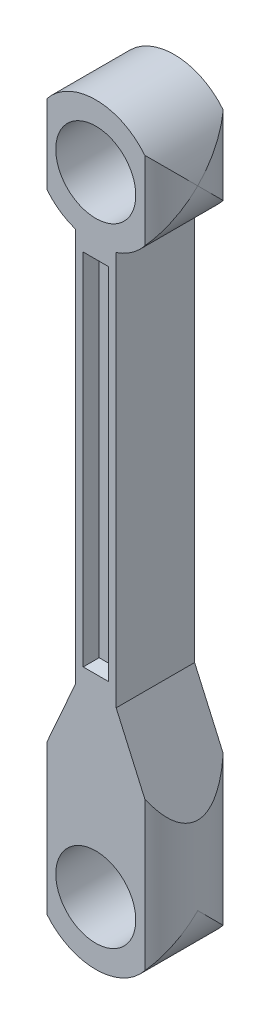
ISO-10303-21;
HEADER;
FILE_DESCRIPTION(('STEP AP214'),'2;1');
FILE_NAME('part.step','',(''),(''),'','','');
FILE_SCHEMA(('AUTOMOTIVE_DESIGN { 1 0 10303 214 1 1 1 1 }'));
ENDSEC;
DATA;
#1=APPLICATION_CONTEXT('core data for automotive mechanical design processes');
#2=APPLICATION_PROTOCOL_DEFINITION('international standard','automotive_design',2000,#1);
#3=PRODUCT_CONTEXT('',#1,'mechanical');
#4=PRODUCT('Part','Part','',(#3));
#5=PRODUCT_RELATED_PRODUCT_CATEGORY('part','',(#4));
#6=PRODUCT_DEFINITION_FORMATION('','',#4);
#7=PRODUCT_DEFINITION_CONTEXT('part definition',#1,'design');
#8=PRODUCT_DEFINITION('design','',#6,#7);
#9=PRODUCT_DEFINITION_SHAPE('','',#8);
#10=(LENGTH_UNIT() NAMED_UNIT(*) SI_UNIT(.MILLI.,.METRE.));
#11=(NAMED_UNIT(*) PLANE_ANGLE_UNIT() SI_UNIT($,.RADIAN.));
#12=(NAMED_UNIT(*) SI_UNIT($,.STERADIAN.) SOLID_ANGLE_UNIT());
#13=UNCERTAINTY_MEASURE_WITH_UNIT(LENGTH_MEASURE(1.E-05),#10,'distance_accuracy_value','');
#14=(GEOMETRIC_REPRESENTATION_CONTEXT(3) GLOBAL_UNCERTAINTY_ASSIGNED_CONTEXT((#13)) GLOBAL_UNIT_ASSIGNED_CONTEXT((#10,
#11,#12)) REPRESENTATION_CONTEXT('',''));
#15=CARTESIAN_POINT('',(0.,0.,0.));
#16=DIRECTION('',(0.,0.,1.));
#17=DIRECTION('',(1.,0.,0.));
#18=AXIS2_PLACEMENT_3D('',#15,#16,#17);
#19=CARTESIAN_POINT('',(10.16,12.7,12.7));
#20=DIRECTION('',(-0.914253955234263,-0.405141586779863,0.));
#21=DIRECTION('',(0.405141586779863,-0.914253955234264,0.));
#22=AXIS2_PLACEMENT_3D('',#19,#20,#21);
#23=PLANE('',#22);
#24=DIRECTION('',(-0.405141586779863,0.914253955234263,0.));
#25=VECTOR('',#24,1.);
#26=CARTESIAN_POINT('',(10.16,12.7,12.7));
#27=LINE('',#26,#25);
#28=CARTESIAN_POINT('',(7.93114745796596,17.7296916403593,12.7));
#29=VERTEX_POINT('',#28);
#30=CARTESIAN_POINT('',(3.302,28.1759566274874,12.7));
#31=VERTEX_POINT('',#30);
#32=EDGE_CURVE('E333',#29,#31,#27,.T.);
#33=ORIENTED_EDGE('',*,*,#32,.F.);
#34=CARTESIAN_POINT('',(0.,35.6273431518332,6.35));
#35=DIRECTION('',(-0.914253955234263,-0.405141586779863,0.));
#36=DIRECTION('',(0.405141586779863,-0.914253955234263,0.));
#37=AXIS2_PLACEMENT_3D('',#34,#35,#36);
#38=ELLIPSE('',#37,25.0776526812601,10.16);
#39=CARTESIAN_POINT('',(7.93114745796596,17.7296916403593,0.));
#40=VERTEX_POINT('',#39);
#41=EDGE_CURVE('E248',#29,#40,#38,.F.);
#42=ORIENTED_EDGE('',*,*,#41,.T.);
#43=DIRECTION('',(-0.405141586779863,0.914253955234263,0.));
#44=VECTOR('',#43,1.);
#45=CARTESIAN_POINT('',(10.16,12.7,0.));
#46=LINE('',#45,#44);
#47=CARTESIAN_POINT('',(3.302,28.1759566274874,0.));
#48=VERTEX_POINT('',#47);
#49=EDGE_CURVE('E350',#40,#48,#46,.T.);
#50=ORIENTED_EDGE('',*,*,#49,.T.);
#51=DIRECTION('',(0.,0.,-1.));
#52=VECTOR('',#51,1.);
#53=CARTESIAN_POINT('',(3.302,28.1759566274874,12.7));
#54=LINE('',#53,#52);
#55=EDGE_CURVE('E12',#31,#48,#54,.T.);
#56=ORIENTED_EDGE('',*,*,#55,.F.);
#57=EDGE_LOOP('',(#33,#42,#50,#56));
#58=FACE_BOUND('',#57,.T.);
#59=ADVANCED_FACE('F38',(#58),#23,.F.);
#60=CARTESIAN_POINT('',(0.,101.6,12.7));
#61=DIRECTION('',(0.,0.,-1.));
#62=DIRECTION('',(-1.,0.,0.));
#63=AXIS2_PLACEMENT_3D('',#60,#61,#62);
#64=CYLINDRICAL_SURFACE('',#63,10.16);
#65=CARTESIAN_POINT('',(0.,101.6,12.7));
#66=DIRECTION('',(0.,0.,1.));
#67=DIRECTION('',(1.,0.,0.));
#68=AXIS2_PLACEMENT_3D('',#65,#66,#67);
#69=CIRCLE('',#68,10.16);
#70=CARTESIAN_POINT('',(-7.93114745796596,95.25,12.7));
#71=VERTEX_POINT('',#70);
#72=CARTESIAN_POINT('',(-3.302,91.9915455977561,12.7));
#73=VERTEX_POINT('',#72);
#74=EDGE_CURVE('E338',#71,#73,#69,.T.);
#75=ORIENTED_EDGE('',*,*,#74,.F.);
#76=CARTESIAN_POINT('',(0.,101.6,6.35));
#77=DIRECTION('',(0.,-0.707106781186548,-0.707106781186547));
#78=DIRECTION('',(0.,0.707106781186548,-0.707106781186547));
#79=AXIS2_PLACEMENT_3D('',#76,#77,#78);
#80=ELLIPSE('',#79,14.3684097937106,10.16);
#81=CARTESIAN_POINT('',(-10.16,101.6,6.35));
#82=VERTEX_POINT('',#81);
#83=EDGE_CURVE('E232',#71,#82,#80,.T.);
#84=ORIENTED_EDGE('',*,*,#83,.T.);
#85=CARTESIAN_POINT('',(0.,101.6,6.35));
#86=DIRECTION('',(0.,0.707106781186548,-0.707106781186547));
#87=DIRECTION('',(0.,-0.707106781186548,-0.707106781186547));
#88=AXIS2_PLACEMENT_3D('',#85,#86,#87);
#89=ELLIPSE('',#88,14.3684097937106,10.16);
#90=CARTESIAN_POINT('',(-7.93114745796597,95.25,0.));
#91=VERTEX_POINT('',#90);
#92=EDGE_CURVE('E210',#82,#91,#89,.F.);
#93=ORIENTED_EDGE('',*,*,#92,.T.);
#94=CARTESIAN_POINT('',(0.,101.6,0.));
#95=DIRECTION('',(0.,0.,1.));
#96=DIRECTION('',(1.,0.,0.));
#97=AXIS2_PLACEMENT_3D('',#94,#95,#96);
#98=CIRCLE('',#97,10.16);
#99=CARTESIAN_POINT('',(-3.302,91.9915455977561,0.));
#100=VERTEX_POINT('',#99);
#101=EDGE_CURVE('E354',#91,#100,#98,.T.);
#102=ORIENTED_EDGE('',*,*,#101,.T.);
#103=DIRECTION('',(0.,0.,-1.));
#104=VECTOR('',#103,1.);
#105=CARTESIAN_POINT('',(-3.302,91.9915455977561,12.7));
#106=LINE('',#105,#104);
#107=EDGE_CURVE('E363',#73,#100,#106,.T.);
#108=ORIENTED_EDGE('',*,*,#107,.F.);
#109=EDGE_LOOP('',(#75,#84,#93,#102,#108));
#110=FACE_BOUND('',#109,.T.);
#111=ADVANCED_FACE('F398',(#110),#64,.T.);
#112=CARTESIAN_POINT('',(7.93114745796597,95.25,0.));
#113=VERTEX_POINT('',#112);
#114=CARTESIAN_POINT('',(10.16,101.6,6.35));
#115=VERTEX_POINT('',#114);
#116=EDGE_CURVE('E203',#113,#115,#89,.F.);
#117=ORIENTED_EDGE('',*,*,#116,.T.);
#118=CARTESIAN_POINT('',(7.93114745796596,95.25,12.7));
#119=VERTEX_POINT('',#118);
#120=EDGE_CURVE('E53',#115,#119,#80,.T.);
#121=ORIENTED_EDGE('',*,*,#120,.T.);
#122=CARTESIAN_POINT('',(3.30199999999999,91.9915455977561,12.7));
#123=VERTEX_POINT('',#122);
#124=EDGE_CURVE('E339',#123,#119,#69,.T.);
#125=ORIENTED_EDGE('',*,*,#124,.F.);
#126=DIRECTION('',(0.,0.,-1.));
#127=VECTOR('',#126,1.);
#128=CARTESIAN_POINT('',(3.30199999999999,91.9915455977561,12.7));
#129=LINE('',#128,#127);
#130=CARTESIAN_POINT('',(3.30199999999999,91.9915455977561,0.));
#131=VERTEX_POINT('',#130);
#132=EDGE_CURVE('E46',#123,#131,#129,.T.);
#133=ORIENTED_EDGE('',*,*,#132,.T.);
#134=EDGE_CURVE('E355',#131,#113,#98,.T.);
#135=ORIENTED_EDGE('',*,*,#134,.T.);
#136=EDGE_LOOP('',(#117,#121,#125,#133,#135));
#137=FACE_BOUND('',#136,.T.);
#138=ADVANCED_FACE('F369',(#137),#64,.T.);
#139=CARTESIAN_POINT('',(-10.16,12.7,12.7));
#140=DIRECTION('',(0.914253955234263,-0.405141586779863,0.));
#141=DIRECTION('',(0.405141586779863,0.914253955234264,0.));
#142=AXIS2_PLACEMENT_3D('',#139,#140,#141);
#143=PLANE('',#142);
#144=DIRECTION('',(-0.405141586779863,-0.914253955234263,0.));
#145=VECTOR('',#144,1.);
#146=CARTESIAN_POINT('',(-10.16,12.7,0.));
#147=LINE('',#146,#145);
#148=CARTESIAN_POINT('',(-3.302,28.1759566274874,0.));
#149=VERTEX_POINT('',#148);
#150=CARTESIAN_POINT('',(-7.93114745796596,17.7296916403593,0.));
#151=VERTEX_POINT('',#150);
#152=EDGE_CURVE('E334',#149,#151,#147,.T.);
#153=ORIENTED_EDGE('',*,*,#152,.T.);
#154=CARTESIAN_POINT('',(0.,35.6273431518332,6.35));
#155=DIRECTION('',(0.914253955234263,-0.405141586779863,0.));
#156=DIRECTION('',(-0.405141586779863,-0.914253955234263,0.));
#157=AXIS2_PLACEMENT_3D('',#154,#155,#156);
#158=ELLIPSE('',#157,25.0776526812601,10.16);
#159=CARTESIAN_POINT('',(-7.93114745796596,17.7296916403593,12.7));
#160=VERTEX_POINT('',#159);
#161=EDGE_CURVE('E211',#151,#160,#158,.F.);
#162=ORIENTED_EDGE('',*,*,#161,.T.);
#163=DIRECTION('',(-0.405141586779863,-0.914253955234263,0.));
#164=VECTOR('',#163,1.);
#165=CARTESIAN_POINT('',(-10.16,12.7,12.7));
#166=LINE('',#165,#164);
#167=CARTESIAN_POINT('',(-3.302,28.1759566274874,12.7));
#168=VERTEX_POINT('',#167);
#169=EDGE_CURVE('E345',#168,#160,#166,.T.);
#170=ORIENTED_EDGE('',*,*,#169,.F.);
#171=DIRECTION('',(0.,0.,-1.));
#172=VECTOR('',#171,1.);
#173=CARTESIAN_POINT('',(-3.302,28.1759566274874,12.7));
#174=LINE('',#173,#172);
#175=EDGE_CURVE('E348',#168,#149,#174,.T.);
#176=ORIENTED_EDGE('',*,*,#175,.T.);
#177=EDGE_LOOP('',(#153,#162,#170,#176));
#178=FACE_BOUND('',#177,.T.);
#179=ADVANCED_FACE('F414',(#178),#143,.F.);
#180=CARTESIAN_POINT('',(0.,0.,12.7));
#181=DIRECTION('',(0.,0.,1.));
#182=DIRECTION('',(1.,0.,0.));
#183=AXIS2_PLACEMENT_3D('',#180,#181,#182);
#184=PLANE('',#183);
#185=DIRECTION('',(0.,-1.,0.));
#186=VECTOR('',#185,1.);
#187=CARTESIAN_POINT('',(-7.93114745796596,111.76,12.7));
#188=LINE('',#187,#186);
#189=CARTESIAN_POINT('',(-7.93114745796596,-6.35,12.7));
#190=VERTEX_POINT('',#189);
#191=EDGE_CURVE('E204',#190,#160,#188,.F.);
#192=ORIENTED_EDGE('',*,*,#191,.F.);
#193=CARTESIAN_POINT('',(0.,0.,12.7));
#194=DIRECTION('',(0.,0.,1.));
#195=DIRECTION('',(1.,0.,0.));
#196=AXIS2_PLACEMENT_3D('',#193,#194,#195);
#197=CIRCLE('',#196,10.16);
#198=CARTESIAN_POINT('',(7.93114745796596,-6.35,12.7));
#199=VERTEX_POINT('',#198);
#200=EDGE_CURVE('E202',#190,#199,#197,.T.);
#201=ORIENTED_EDGE('',*,*,#200,.T.);
#202=DIRECTION('',(0.,-1.,0.));
#203=VECTOR('',#202,1.);
#204=CARTESIAN_POINT('',(7.93114745796596,111.76,12.7));
#205=LINE('',#204,#203);
#206=EDGE_CURVE('E218',#29,#199,#205,.T.);
#207=ORIENTED_EDGE('',*,*,#206,.F.);
#208=ORIENTED_EDGE('',*,*,#32,.T.);
#209=DIRECTION('',(0.,1.,0.));
#210=VECTOR('',#209,1.);
#211=CARTESIAN_POINT('',(3.302,91.9915455977561,12.7));
#212=LINE('',#211,#210);
#213=EDGE_CURVE('E336',#31,#123,#212,.T.);
#214=ORIENTED_EDGE('',*,*,#213,.T.);
#215=ORIENTED_EDGE('',*,*,#124,.T.);
#216=CARTESIAN_POINT('',(7.93114745796597,107.95,12.7));
#217=VERTEX_POINT('',#216);
#218=EDGE_CURVE('E221',#217,#119,#205,.T.);
#219=ORIENTED_EDGE('',*,*,#218,.F.);
#220=CARTESIAN_POINT('',(-7.93114745796597,107.95,12.7));
#221=VERTEX_POINT('',#220);
#222=EDGE_CURVE('E343',#217,#221,#69,.T.);
#223=ORIENTED_EDGE('',*,*,#222,.T.);
#224=EDGE_CURVE('E213',#71,#221,#188,.F.);
#225=ORIENTED_EDGE('',*,*,#224,.F.);
#226=ORIENTED_EDGE('',*,*,#74,.T.);
#227=DIRECTION('',(0.,-1.,0.));
#228=VECTOR('',#227,1.);
#229=CARTESIAN_POINT('',(-3.302,91.9915455977561,12.7));
#230=LINE('',#229,#228);
#231=EDGE_CURVE('E342',#73,#168,#230,.T.);
#232=ORIENTED_EDGE('',*,*,#231,.T.);
#233=ORIENTED_EDGE('',*,*,#169,.T.);
#234=EDGE_LOOP('',(#192,#201,#207,#208,#214,#215,#219,#223,#225,#226,#232,#233));
#235=FACE_BOUND('',#234,.T.);
#236=DIRECTION('',(0.,-1.,0.));
#237=VECTOR('',#236,1.);
#238=CARTESIAN_POINT('',(-2.032,89.408,12.7));
#239=LINE('',#238,#237);
#240=CARTESIAN_POINT('',(-2.032,89.408,12.7));
#241=VERTEX_POINT('',#240);
#242=CARTESIAN_POINT('',(-2.03199999999999,31.242,12.7));
#243=VERTEX_POINT('',#242);
#244=EDGE_CURVE('E269',#241,#243,#239,.T.);
#245=ORIENTED_EDGE('',*,*,#244,.F.);
#246=DIRECTION('',(-1.,0.,0.));
#247=VECTOR('',#246,1.);
#248=CARTESIAN_POINT('',(-2.032,89.408,12.7));
#249=LINE('',#248,#247);
#250=CARTESIAN_POINT('',(2.032,89.408,12.7));
#251=VERTEX_POINT('',#250);
#252=EDGE_CURVE('E295',#251,#241,#249,.T.);
#253=ORIENTED_EDGE('',*,*,#252,.F.);
#254=DIRECTION('',(0.,1.,0.));
#255=VECTOR('',#254,1.);
#256=CARTESIAN_POINT('',(2.032,89.408,12.7));
#257=LINE('',#256,#255);
#258=CARTESIAN_POINT('',(2.03200000000001,31.242,12.7));
#259=VERTEX_POINT('',#258);
#260=EDGE_CURVE('E292',#259,#251,#257,.T.);
#261=ORIENTED_EDGE('',*,*,#260,.F.);
#262=DIRECTION('',(1.,0.,0.));
#263=VECTOR('',#262,1.);
#264=CARTESIAN_POINT('',(-2.03199999999999,31.242,12.7));
#265=LINE('',#264,#263);
#266=EDGE_CURVE('E289',#243,#259,#265,.T.);
#267=ORIENTED_EDGE('',*,*,#266,.F.);
#268=EDGE_LOOP('',(#245,#253,#261,#267));
#269=FACE_BOUND('',#268,.T.);
#270=CARTESIAN_POINT('',(0.,0.,12.7));
#271=DIRECTION('',(0.,0.,1.));
#272=DIRECTION('',(1.,0.,0.));
#273=AXIS2_PLACEMENT_3D('',#270,#271,#272);
#274=CIRCLE('',#273,6.477);
#275=CARTESIAN_POINT('',(-6.477,0.,12.7));
#276=VERTEX_POINT('',#275);
#277=EDGE_CURVE('E326',#276,#276,#274,.T.);
#278=ORIENTED_EDGE('',*,*,#277,.F.);
#279=EDGE_LOOP('',(#278));
#280=FACE_BOUND('',#279,.T.);
#281=CARTESIAN_POINT('',(0.,101.6,12.7));
#282=DIRECTION('',(0.,0.,1.));
#283=DIRECTION('',(1.,0.,0.));
#284=AXIS2_PLACEMENT_3D('',#281,#282,#283);
#285=CIRCLE('',#284,6.477);
#286=CARTESIAN_POINT('',(-6.477,101.6,12.7));
#287=VERTEX_POINT('',#286);
#288=EDGE_CURVE('E320',#287,#287,#285,.T.);
#289=ORIENTED_EDGE('',*,*,#288,.F.);
#290=EDGE_LOOP('',(#289));
#291=FACE_BOUND('',#290,.T.);
#292=ADVANCED_FACE('F379',(#235,#269,#280,#291),#184,.T.);
#293=CARTESIAN_POINT('',(0.,0.,0.));
#294=DIRECTION('',(0.,0.,1.));
#295=DIRECTION('',(1.,0.,0.));
#296=AXIS2_PLACEMENT_3D('',#293,#294,#295);
#297=PLANE('',#296);
#298=DIRECTION('',(-1.,0.,0.));
#299=VECTOR('',#298,1.);
#300=CARTESIAN_POINT('',(2.03199999999999,31.242,0.));
#301=LINE('',#300,#299);
#302=CARTESIAN_POINT('',(2.03199999999999,31.242,0.));
#303=VERTEX_POINT('',#302);
#304=CARTESIAN_POINT('',(-2.03200000000001,31.242,0.));
#305=VERTEX_POINT('',#304);
#306=EDGE_CURVE('E216',#303,#305,#301,.T.);
#307=ORIENTED_EDGE('',*,*,#306,.F.);
#308=DIRECTION('',(0.,-1.,0.));
#309=VECTOR('',#308,1.);
#310=CARTESIAN_POINT('',(2.032,89.408,0.));
#311=LINE('',#310,#309);
#312=CARTESIAN_POINT('',(2.032,89.408,0.));
#313=VERTEX_POINT('',#312);
#314=EDGE_CURVE('E214',#313,#303,#311,.T.);
#315=ORIENTED_EDGE('',*,*,#314,.F.);
#316=DIRECTION('',(1.,0.,0.));
#317=VECTOR('',#316,1.);
#318=CARTESIAN_POINT('',(2.032,89.408,0.));
#319=LINE('',#318,#317);
#320=CARTESIAN_POINT('',(-2.032,89.408,0.));
#321=VERTEX_POINT('',#320);
#322=EDGE_CURVE('E263',#321,#313,#319,.T.);
#323=ORIENTED_EDGE('',*,*,#322,.F.);
#324=DIRECTION('',(0.,1.,0.));
#325=VECTOR('',#324,1.);
#326=CARTESIAN_POINT('',(-2.032,89.408,0.));
#327=LINE('',#326,#325);
#328=EDGE_CURVE('E260',#305,#321,#327,.T.);
#329=ORIENTED_EDGE('',*,*,#328,.F.);
#330=EDGE_LOOP('',(#307,#315,#323,#329));
#331=FACE_BOUND('',#330,.T.);
#332=CARTESIAN_POINT('',(0.,0.,0.));
#333=DIRECTION('',(0.,0.,1.));
#334=DIRECTION('',(1.,0.,0.));
#335=AXIS2_PLACEMENT_3D('',#332,#333,#334);
#336=CIRCLE('',#335,10.16);
#337=CARTESIAN_POINT('',(-7.93114745796597,-6.35,0.));
#338=VERTEX_POINT('',#337);
#339=CARTESIAN_POINT('',(7.93114745796597,-6.35,0.));
#340=VERTEX_POINT('',#339);
#341=EDGE_CURVE('E329',#338,#340,#336,.T.);
#342=ORIENTED_EDGE('',*,*,#341,.F.);
#343=DIRECTION('',(0.,-1.,0.));
#344=VECTOR('',#343,1.);
#345=CARTESIAN_POINT('',(-7.93114745796597,111.76,0.));
#346=LINE('',#345,#344);
#347=EDGE_CURVE('E193',#338,#151,#346,.F.);
#348=ORIENTED_EDGE('',*,*,#347,.T.);
#349=ORIENTED_EDGE('',*,*,#152,.F.);
#350=DIRECTION('',(0.,-1.,0.));
#351=VECTOR('',#350,1.);
#352=CARTESIAN_POINT('',(-3.302,91.9915455977561,0.));
#353=LINE('',#352,#351);
#354=EDGE_CURVE('E357',#100,#149,#353,.T.);
#355=ORIENTED_EDGE('',*,*,#354,.F.);
#356=ORIENTED_EDGE('',*,*,#101,.F.);
#357=CARTESIAN_POINT('',(-7.93114745796597,107.95,0.));
#358=VERTEX_POINT('',#357);
#359=EDGE_CURVE('E61',#91,#358,#346,.F.);
#360=ORIENTED_EDGE('',*,*,#359,.T.);
#361=CARTESIAN_POINT('',(7.93114745796597,107.95,0.));
#362=VERTEX_POINT('',#361);
#363=EDGE_CURVE('E358',#362,#358,#98,.T.);
#364=ORIENTED_EDGE('',*,*,#363,.F.);
#365=DIRECTION('',(0.,-1.,0.));
#366=VECTOR('',#365,1.);
#367=CARTESIAN_POINT('',(7.93114745796597,111.76,0.));
#368=LINE('',#367,#366);
#369=EDGE_CURVE('E242',#362,#113,#368,.T.);
#370=ORIENTED_EDGE('',*,*,#369,.T.);
#371=ORIENTED_EDGE('',*,*,#134,.F.);
#372=DIRECTION('',(0.,1.,0.));
#373=VECTOR('',#372,1.);
#374=CARTESIAN_POINT('',(3.302,91.9915455977561,0.));
#375=LINE('',#374,#373);
#376=EDGE_CURVE('E352',#48,#131,#375,.T.);
#377=ORIENTED_EDGE('',*,*,#376,.F.);
#378=ORIENTED_EDGE('',*,*,#49,.F.);
#379=EDGE_CURVE('E219',#40,#340,#368,.T.);
#380=ORIENTED_EDGE('',*,*,#379,.T.);
#381=EDGE_LOOP('',(#342,#348,#349,#355,#356,#360,#364,#370,#371,#377,#378,#380));
#382=FACE_BOUND('',#381,.T.);
#383=CARTESIAN_POINT('',(0.,0.,0.));
#384=DIRECTION('',(0.,0.,1.));
#385=DIRECTION('',(1.,0.,0.));
#386=AXIS2_PLACEMENT_3D('',#383,#384,#385);
#387=CIRCLE('',#386,6.477);
#388=CARTESIAN_POINT('',(-6.477,0.,0.));
#389=VERTEX_POINT('',#388);
#390=EDGE_CURVE('E323',#389,#389,#387,.T.);
#391=ORIENTED_EDGE('',*,*,#390,.T.);
#392=EDGE_LOOP('',(#391));
#393=FACE_BOUND('',#392,.T.);
#394=CARTESIAN_POINT('',(0.,101.6,0.));
#395=DIRECTION('',(0.,0.,1.));
#396=DIRECTION('',(1.,0.,0.));
#397=AXIS2_PLACEMENT_3D('',#394,#395,#396);
#398=CIRCLE('',#397,6.477);
#399=CARTESIAN_POINT('',(-6.477,101.6,0.));
#400=VERTEX_POINT('',#399);
#401=EDGE_CURVE('E301',#400,#400,#398,.T.);
#402=ORIENTED_EDGE('',*,*,#401,.T.);
#403=EDGE_LOOP('',(#402));
#404=FACE_BOUND('',#403,.T.);
#405=ADVANCED_FACE('F373',(#331,#382,#393,#404),#297,.F.);
#406=CARTESIAN_POINT('',(0.,0.,12.7));
#407=DIRECTION('',(0.,0.,-1.));
#408=DIRECTION('',(-1.,0.,0.));
#409=AXIS2_PLACEMENT_3D('',#406,#407,#408);
#410=CYLINDRICAL_SURFACE('',#409,10.16);
#411=ORIENTED_EDGE('',*,*,#200,.F.);
#412=CARTESIAN_POINT('',(0.,0.,6.35));
#413=DIRECTION('',(0.,-0.707106781186548,-0.707106781186547));
#414=DIRECTION('',(0.,0.707106781186548,-0.707106781186547));
#415=AXIS2_PLACEMENT_3D('',#412,#413,#414);
#416=ELLIPSE('',#415,14.3684097937106,10.16);
#417=CARTESIAN_POINT('',(-10.16,0.,6.35));
#418=VERTEX_POINT('',#417);
#419=EDGE_CURVE('E190',#190,#418,#416,.T.);
#420=ORIENTED_EDGE('',*,*,#419,.T.);
#421=CARTESIAN_POINT('',(0.,0.,6.35));
#422=DIRECTION('',(0.,0.707106781186548,-0.707106781186547));
#423=DIRECTION('',(0.,-0.707106781186548,-0.707106781186547));
#424=AXIS2_PLACEMENT_3D('',#421,#422,#423);
#425=ELLIPSE('',#424,14.3684097937106,10.16);
#426=EDGE_CURVE('E187',#418,#338,#425,.F.);
#427=ORIENTED_EDGE('',*,*,#426,.T.);
#428=ORIENTED_EDGE('',*,*,#341,.T.);
#429=CARTESIAN_POINT('',(10.16,0.,6.35));
#430=VERTEX_POINT('',#429);
#431=EDGE_CURVE('E198',#340,#430,#425,.F.);
#432=ORIENTED_EDGE('',*,*,#431,.T.);
#433=EDGE_CURVE('E206',#430,#199,#416,.T.);
#434=ORIENTED_EDGE('',*,*,#433,.T.);
#435=EDGE_LOOP('',(#411,#420,#427,#428,#432,#434));
#436=FACE_BOUND('',#435,.T.);
#437=ADVANCED_FACE('F40',(#436),#410,.T.);
#438=CARTESIAN_POINT('',(3.302,91.9915455977561,12.7));
#439=DIRECTION('',(-1.,0.,0.));
#440=DIRECTION('',(0.,-1.,0.));
#441=AXIS2_PLACEMENT_3D('',#438,#439,#440);
#442=PLANE('',#441);
#443=ORIENTED_EDGE('',*,*,#376,.T.);
#444=ORIENTED_EDGE('',*,*,#132,.F.);
#445=ORIENTED_EDGE('',*,*,#213,.F.);
#446=ORIENTED_EDGE('',*,*,#55,.T.);
#447=EDGE_LOOP('',(#443,#444,#445,#446));
#448=FACE_BOUND('',#447,.T.);
#449=ADVANCED_FACE('F375',(#448),#442,.F.);
#450=CARTESIAN_POINT('',(0.,101.6,6.35));
#451=DIRECTION('',(0.,0.707106781186548,-0.707106781186547));
#452=DIRECTION('',(0.,-0.707106781186548,-0.707106781186547));
#453=AXIS2_PLACEMENT_3D('',#450,#451,#452);
#454=ELLIPSE('',#453,14.3684097937106,10.16);
#455=EDGE_CURVE('E208',#217,#115,#454,.T.);
#456=ORIENTED_EDGE('',*,*,#455,.T.);
#457=CARTESIAN_POINT('',(0.,101.6,6.35));
#458=DIRECTION('',(0.,-0.707106781186548,-0.707106781186547));
#459=DIRECTION('',(0.,0.707106781186548,-0.707106781186547));
#460=AXIS2_PLACEMENT_3D('',#457,#458,#459);
#461=ELLIPSE('',#460,14.3684097937106,10.16);
#462=EDGE_CURVE('E239',#115,#362,#461,.F.);
#463=ORIENTED_EDGE('',*,*,#462,.T.);
#464=ORIENTED_EDGE('',*,*,#363,.T.);
#465=EDGE_CURVE('E251',#358,#82,#461,.F.);
#466=ORIENTED_EDGE('',*,*,#465,.T.);
#467=EDGE_CURVE('E228',#82,#221,#454,.T.);
#468=ORIENTED_EDGE('',*,*,#467,.T.);
#469=ORIENTED_EDGE('',*,*,#222,.F.);
#470=EDGE_LOOP('',(#456,#463,#464,#466,#468,#469));
#471=FACE_BOUND('',#470,.T.);
#472=ADVANCED_FACE('F404',(#471),#64,.T.);
#473=CARTESIAN_POINT('',(-3.302,91.9915455977561,12.7));
#474=DIRECTION('',(1.,0.,0.));
#475=DIRECTION('',(0.,1.,0.));
#476=AXIS2_PLACEMENT_3D('',#473,#474,#475);
#477=PLANE('',#476);
#478=ORIENTED_EDGE('',*,*,#354,.T.);
#479=ORIENTED_EDGE('',*,*,#175,.F.);
#480=ORIENTED_EDGE('',*,*,#231,.F.);
#481=ORIENTED_EDGE('',*,*,#107,.T.);
#482=EDGE_LOOP('',(#478,#479,#480,#481));
#483=FACE_BOUND('',#482,.T.);
#484=ADVANCED_FACE('F409',(#483),#477,.F.);
#485=CARTESIAN_POINT('',(0.,0.,12.7));
#486=DIRECTION('',(0.,0.,-1.));
#487=DIRECTION('',(-1.,0.,0.));
#488=AXIS2_PLACEMENT_3D('',#485,#486,#487);
#489=CYLINDRICAL_SURFACE('',#488,6.477);
#490=CARTESIAN_POINT('',(-6.477,0.,12.7));
#491=CARTESIAN_POINT('',(-6.477,0.,12.5677083333333));
#492=CARTESIAN_POINT('',(-6.477,0.,12.4354166666667));
#493=CARTESIAN_POINT('',(-6.477,0.,12.1708333333333));
#494=CARTESIAN_POINT('',(-6.477,0.,12.0385416666667));
#495=CARTESIAN_POINT('',(-6.477,0.,11.7739583333333));
#496=CARTESIAN_POINT('',(-6.477,0.,11.6416666666667));
#497=CARTESIAN_POINT('',(-6.477,0.,11.3770833333333));
#498=CARTESIAN_POINT('',(-6.477,0.,11.2447916666667));
#499=CARTESIAN_POINT('',(-6.477,0.,10.9802083333333));
#500=CARTESIAN_POINT('',(-6.477,0.,10.8479166666667));
#501=CARTESIAN_POINT('',(-6.477,0.,10.5833333333333));
#502=CARTESIAN_POINT('',(-6.477,0.,10.4510416666667));
#503=CARTESIAN_POINT('',(-6.477,0.,10.1864583333333));
#504=CARTESIAN_POINT('',(-6.477,0.,10.0541666666667));
#505=CARTESIAN_POINT('',(-6.477,0.,9.78958333333333));
#506=CARTESIAN_POINT('',(-6.477,0.,9.65729166666667));
#507=CARTESIAN_POINT('',(-6.477,0.,9.39270833333333));
#508=CARTESIAN_POINT('',(-6.477,0.,9.26041666666667));
#509=CARTESIAN_POINT('',(-6.477,0.,8.99583333333333));
#510=CARTESIAN_POINT('',(-6.477,0.,8.86354166666667));
#511=CARTESIAN_POINT('',(-6.477,0.,8.59895833333333));
#512=CARTESIAN_POINT('',(-6.477,0.,8.46666666666667));
#513=CARTESIAN_POINT('',(-6.477,0.,8.20208333333333));
#514=CARTESIAN_POINT('',(-6.477,0.,8.06979166666667));
#515=CARTESIAN_POINT('',(-6.477,0.,7.80520833333333));
#516=CARTESIAN_POINT('',(-6.477,0.,7.67291666666667));
#517=CARTESIAN_POINT('',(-6.477,0.,7.40833333333333));
#518=CARTESIAN_POINT('',(-6.477,0.,7.27604166666667));
#519=CARTESIAN_POINT('',(-6.477,0.,7.01145833333333));
#520=CARTESIAN_POINT('',(-6.477,0.,6.87916666666667));
#521=CARTESIAN_POINT('',(-6.477,0.,6.61458333333333));
#522=CARTESIAN_POINT('',(-6.477,0.,6.48229166666667));
#523=CARTESIAN_POINT('',(-6.477,0.,6.21770833333333));
#524=CARTESIAN_POINT('',(-6.477,0.,6.08541666666667));
#525=CARTESIAN_POINT('',(-6.477,0.,5.82083333333333));
#526=CARTESIAN_POINT('',(-6.477,0.,5.68854166666667));
#527=CARTESIAN_POINT('',(-6.477,0.,5.42395833333333));
#528=CARTESIAN_POINT('',(-6.477,0.,5.29166666666667));
#529=CARTESIAN_POINT('',(-6.477,0.,5.02708333333333));
#530=CARTESIAN_POINT('',(-6.477,0.,4.89479166666667));
#531=CARTESIAN_POINT('',(-6.477,0.,4.63020833333333));
#532=CARTESIAN_POINT('',(-6.477,0.,4.49791666666667));
#533=CARTESIAN_POINT('',(-6.477,0.,4.23333333333333));
#534=CARTESIAN_POINT('',(-6.477,0.,4.10104166666667));
#535=CARTESIAN_POINT('',(-6.477,0.,3.83645833333333));
#536=CARTESIAN_POINT('',(-6.477,0.,3.70416666666667));
#537=CARTESIAN_POINT('',(-6.477,0.,3.43958333333333));
#538=CARTESIAN_POINT('',(-6.477,0.,3.30729166666667));
#539=CARTESIAN_POINT('',(-6.477,0.,3.04270833333333));
#540=CARTESIAN_POINT('',(-6.477,0.,2.91041666666667));
#541=CARTESIAN_POINT('',(-6.477,0.,2.64583333333333));
#542=CARTESIAN_POINT('',(-6.477,0.,2.51354166666667));
#543=CARTESIAN_POINT('',(-6.477,0.,2.24895833333333));
#544=CARTESIAN_POINT('',(-6.477,0.,2.11666666666667));
#545=CARTESIAN_POINT('',(-6.477,0.,1.85208333333333));
#546=CARTESIAN_POINT('',(-6.477,0.,1.71979166666667));
#547=CARTESIAN_POINT('',(-6.477,0.,1.45520833333333));
#548=CARTESIAN_POINT('',(-6.477,0.,1.32291666666667));
#549=CARTESIAN_POINT('',(-6.477,0.,1.05833333333333));
#550=CARTESIAN_POINT('',(-6.477,0.,0.926041666666666));
#551=CARTESIAN_POINT('',(-6.477,0.,0.661458333333333));
#552=CARTESIAN_POINT('',(-6.477,0.,0.529166666666666));
#553=CARTESIAN_POINT('',(-6.477,0.,0.264583333333333));
#554=CARTESIAN_POINT('',(-6.477,0.,0.132291666666667));
#555=CARTESIAN_POINT('',(-6.477,0.,0.));
#556=B_SPLINE_CURVE_WITH_KNOTS('',3,(#490,#491,#492,#493,#494,#495,#496,#497,#498,#499,#500,
#501,#502,#503,#504,#505,#506,#507,#508,#509,#510,#511,#512,#513,#514,#515,#516,#517,#518,#519,
#520,#521,#522,#523,#524,#525,#526,#527,#528,#529,#530,#531,#532,#533,#534,#535,#536,#537,#538,
#539,#540,#541,#542,#543,#544,#545,#546,#547,#548,#549,#550,#551,#552,#553,#554,#555),
.UNSPECIFIED.,.F.,.F.,(4,2,2,2,2,2,2,2,2,2,2,2,2,2,2,2,2,2,2,2,2,2,2,2,2,2,2,2,2,2,2,2,4),(0.,
0.396875000000001,0.793750000000001,1.190625,1.5875,1.984375,2.38125,2.778125,3.175,3.571875,
3.96875,4.365625,4.7625,5.159375,5.55625,5.953125,6.35,6.746875,7.14375,7.540625,7.9375,
8.334375,8.73125,9.128125,9.525,9.921875,10.31875,10.715625,11.1125,11.509375,11.90625,
12.303125,12.7),.UNSPECIFIED.);
#557=EDGE_CURVE('BSEAM412',#276,#389,#556,.T.);
#558=ORIENTED_EDGE('',*,*,#277,.T.);
#559=ORIENTED_EDGE('',*,*,#390,.F.);
#560=ORIENTED_EDGE('',*,*,#557,.T.);
#561=ORIENTED_EDGE('',*,*,#557,.F.);
#562=EDGE_LOOP('',(#558,#560,#559,#561));
#563=FACE_BOUND('',#562,.T.);
#564=ADVANCED_FACE('F412',(#563),#489,.F.);
#565=CARTESIAN_POINT('',(0.,101.6,12.7));
#566=DIRECTION('',(0.,0.,-1.));
#567=DIRECTION('',(-1.,0.,0.));
#568=AXIS2_PLACEMENT_3D('',#565,#566,#567);
#569=CYLINDRICAL_SURFACE('',#568,6.477);
#570=CARTESIAN_POINT('',(-6.477,101.6,12.7));
#571=CARTESIAN_POINT('',(-6.477,101.6,12.5677083333333));
#572=CARTESIAN_POINT('',(-6.477,101.6,12.4354166666667));
#573=CARTESIAN_POINT('',(-6.477,101.6,12.1708333333333));
#574=CARTESIAN_POINT('',(-6.477,101.6,12.0385416666667));
#575=CARTESIAN_POINT('',(-6.477,101.6,11.7739583333333));
#576=CARTESIAN_POINT('',(-6.477,101.6,11.6416666666667));
#577=CARTESIAN_POINT('',(-6.477,101.6,11.3770833333333));
#578=CARTESIAN_POINT('',(-6.477,101.6,11.2447916666667));
#579=CARTESIAN_POINT('',(-6.477,101.6,10.9802083333333));
#580=CARTESIAN_POINT('',(-6.477,101.6,10.8479166666667));
#581=CARTESIAN_POINT('',(-6.477,101.6,10.5833333333333));
#582=CARTESIAN_POINT('',(-6.477,101.6,10.4510416666667));
#583=CARTESIAN_POINT('',(-6.477,101.6,10.1864583333333));
#584=CARTESIAN_POINT('',(-6.477,101.6,10.0541666666667));
#585=CARTESIAN_POINT('',(-6.477,101.6,9.78958333333333));
#586=CARTESIAN_POINT('',(-6.477,101.6,9.65729166666667));
#587=CARTESIAN_POINT('',(-6.477,101.6,9.39270833333333));
#588=CARTESIAN_POINT('',(-6.477,101.6,9.26041666666667));
#589=CARTESIAN_POINT('',(-6.477,101.6,8.99583333333333));
#590=CARTESIAN_POINT('',(-6.477,101.6,8.86354166666667));
#591=CARTESIAN_POINT('',(-6.477,101.6,8.59895833333333));
#592=CARTESIAN_POINT('',(-6.477,101.6,8.46666666666667));
#593=CARTESIAN_POINT('',(-6.477,101.6,8.20208333333333));
#594=CARTESIAN_POINT('',(-6.477,101.6,8.06979166666667));
#595=CARTESIAN_POINT('',(-6.477,101.6,7.80520833333333));
#596=CARTESIAN_POINT('',(-6.477,101.6,7.67291666666667));
#597=CARTESIAN_POINT('',(-6.477,101.6,7.40833333333333));
#598=CARTESIAN_POINT('',(-6.477,101.6,7.27604166666667));
#599=CARTESIAN_POINT('',(-6.477,101.6,7.01145833333333));
#600=CARTESIAN_POINT('',(-6.477,101.6,6.87916666666667));
#601=CARTESIAN_POINT('',(-6.477,101.6,6.61458333333333));
#602=CARTESIAN_POINT('',(-6.477,101.6,6.48229166666667));
#603=CARTESIAN_POINT('',(-6.477,101.6,6.21770833333333));
#604=CARTESIAN_POINT('',(-6.477,101.6,6.08541666666667));
#605=CARTESIAN_POINT('',(-6.477,101.6,5.82083333333333));
#606=CARTESIAN_POINT('',(-6.477,101.6,5.68854166666667));
#607=CARTESIAN_POINT('',(-6.477,101.6,5.42395833333333));
#608=CARTESIAN_POINT('',(-6.477,101.6,5.29166666666667));
#609=CARTESIAN_POINT('',(-6.477,101.6,5.02708333333333));
#610=CARTESIAN_POINT('',(-6.477,101.6,4.89479166666667));
#611=CARTESIAN_POINT('',(-6.477,101.6,4.63020833333333));
#612=CARTESIAN_POINT('',(-6.477,101.6,4.49791666666667));
#613=CARTESIAN_POINT('',(-6.477,101.6,4.23333333333333));
#614=CARTESIAN_POINT('',(-6.477,101.6,4.10104166666667));
#615=CARTESIAN_POINT('',(-6.477,101.6,3.83645833333333));
#616=CARTESIAN_POINT('',(-6.477,101.6,3.70416666666667));
#617=CARTESIAN_POINT('',(-6.477,101.6,3.43958333333333));
#618=CARTESIAN_POINT('',(-6.477,101.6,3.30729166666667));
#619=CARTESIAN_POINT('',(-6.477,101.6,3.04270833333333));
#620=CARTESIAN_POINT('',(-6.477,101.6,2.91041666666667));
#621=CARTESIAN_POINT('',(-6.477,101.6,2.64583333333333));
#622=CARTESIAN_POINT('',(-6.477,101.6,2.51354166666667));
#623=CARTESIAN_POINT('',(-6.477,101.6,2.24895833333333));
#624=CARTESIAN_POINT('',(-6.477,101.6,2.11666666666667));
#625=CARTESIAN_POINT('',(-6.477,101.6,1.85208333333333));
#626=CARTESIAN_POINT('',(-6.477,101.6,1.71979166666667));
#627=CARTESIAN_POINT('',(-6.477,101.6,1.45520833333333));
#628=CARTESIAN_POINT('',(-6.477,101.6,1.32291666666667));
#629=CARTESIAN_POINT('',(-6.477,101.6,1.05833333333333));
#630=CARTESIAN_POINT('',(-6.477,101.6,0.926041666666666));
#631=CARTESIAN_POINT('',(-6.477,101.6,0.661458333333333));
#632=CARTESIAN_POINT('',(-6.477,101.6,0.529166666666666));
#633=CARTESIAN_POINT('',(-6.477,101.6,0.264583333333333));
#634=CARTESIAN_POINT('',(-6.477,101.6,0.132291666666667));
#635=CARTESIAN_POINT('',(-6.477,101.6,0.));
#636=B_SPLINE_CURVE_WITH_KNOTS('',3,(#570,#571,#572,#573,#574,#575,#576,#577,#578,#579,#580,
#581,#582,#583,#584,#585,#586,#587,#588,#589,#590,#591,#592,#593,#594,#595,#596,#597,#598,#599,
#600,#601,#602,#603,#604,#605,#606,#607,#608,#609,#610,#611,#612,#613,#614,#615,#616,#617,#618,
#619,#620,#621,#622,#623,#624,#625,#626,#627,#628,#629,#630,#631,#632,#633,#634,#635),
.UNSPECIFIED.,.F.,.F.,(4,2,2,2,2,2,2,2,2,2,2,2,2,2,2,2,2,2,2,2,2,2,2,2,2,2,2,2,2,2,2,2,4),(0.,
0.396875000000001,0.793750000000001,1.190625,1.5875,1.984375,2.38125,2.778125,3.175,3.571875,
3.96875,4.365625,4.7625,5.159375,5.55625,5.953125,6.35,6.746875,7.14375,7.540625,7.9375,
8.334375,8.73125,9.128125,9.525,9.921875,10.31875,10.715625,11.1125,11.509375,11.90625,
12.303125,12.7),.UNSPECIFIED.);
#637=EDGE_CURVE('BSEAM425',#287,#400,#636,.T.);
#638=ORIENTED_EDGE('',*,*,#288,.T.);
#639=ORIENTED_EDGE('',*,*,#401,.F.);
#640=ORIENTED_EDGE('',*,*,#637,.T.);
#641=ORIENTED_EDGE('',*,*,#637,.F.);
#642=EDGE_LOOP('',(#638,#640,#639,#641));
#643=FACE_BOUND('',#642,.T.);
#644=ADVANCED_FACE('F425',(#643),#569,.F.);
#645=CARTESIAN_POINT('',(-2.032,89.408,12.7));
#646=DIRECTION('',(-0.965925826289068,0.,-0.258819045102521));
#647=DIRECTION('',(-0.258819045102521,0.,0.965925826289068));
#648=AXIS2_PLACEMENT_3D('',#645,#646,#647);
#649=PLANE('',#648);
#650=ORIENTED_EDGE('',*,*,#244,.T.);
#651=DIRECTION('',(-0.250562807085732,-0.250562807085732,0.935113126531029));
#652=VECTOR('',#651,1.);
#653=CARTESIAN_POINT('',(1.61976154266047,34.8937615426605,-0.928559614334912));
#654=LINE('',#653,#652);
#655=CARTESIAN_POINT('',(-1.48752724097995,31.78647275902,10.668));
#656=VERTEX_POINT('',#655);
#657=EDGE_CURVE('E303',#656,#243,#654,.T.);
#658=ORIENTED_EDGE('',*,*,#657,.F.);
#659=DIRECTION('',(0.,-1.,0.));
#660=VECTOR('',#659,1.);
#661=CARTESIAN_POINT('',(-1.48752724097995,0.,10.668));
#662=LINE('',#661,#660);
#663=CARTESIAN_POINT('',(-1.48752724097996,88.86352724098,10.668));
#664=VERTEX_POINT('',#663);
#665=EDGE_CURVE('E298',#664,#656,#662,.T.);
#666=ORIENTED_EDGE('',*,*,#665,.F.);
#667=DIRECTION('',(-0.250562807085732,0.250562807085732,0.935113126531029));
#668=VECTOR('',#667,1.);
#669=CARTESIAN_POINT('',(-2.032,89.408,12.7));
#670=LINE('',#669,#668);
#671=EDGE_CURVE('E299',#664,#241,#670,.T.);
#672=ORIENTED_EDGE('',*,*,#671,.T.);
#673=EDGE_LOOP('',(#650,#658,#666,#672));
#674=FACE_BOUND('',#673,.T.);
#675=ADVANCED_FACE('F429',(#674),#649,.F.);
#676=CARTESIAN_POINT('',(-2.032,89.408,12.7));
#677=DIRECTION('',(0.,0.965925826289068,-0.258819045102521));
#678=DIRECTION('',(0.,0.258819045102521,0.965925826289068));
#679=AXIS2_PLACEMENT_3D('',#676,#677,#678);
#680=PLANE('',#679);
#681=ORIENTED_EDGE('',*,*,#252,.T.);
#682=ORIENTED_EDGE('',*,*,#671,.F.);
#683=DIRECTION('',(-1.,0.,0.));
#684=VECTOR('',#683,1.);
#685=CARTESIAN_POINT('',(0.,88.86352724098,10.668));
#686=LINE('',#685,#684);
#687=CARTESIAN_POINT('',(1.48752724097996,88.86352724098,10.668));
#688=VERTEX_POINT('',#687);
#689=EDGE_CURVE('E307',#688,#664,#686,.T.);
#690=ORIENTED_EDGE('',*,*,#689,.F.);
#691=DIRECTION('',(0.250562807085732,0.250562807085732,0.935113126531029));
#692=VECTOR('',#691,1.);
#693=CARTESIAN_POINT('',(2.032,89.408,12.7));
#694=LINE('',#693,#692);
#695=EDGE_CURVE('E302',#688,#251,#694,.T.);
#696=ORIENTED_EDGE('',*,*,#695,.T.);
#697=EDGE_LOOP('',(#681,#682,#690,#696));
#698=FACE_BOUND('',#697,.T.);
#699=ADVANCED_FACE('F431',(#698),#680,.F.);
#700=CARTESIAN_POINT('',(2.032,89.408,12.7));
#701=DIRECTION('',(0.965925826289068,0.,-0.258819045102521));
#702=DIRECTION('',(-0.258819045102521,0.,-0.965925826289068));
#703=AXIS2_PLACEMENT_3D('',#700,#701,#702);
#704=PLANE('',#703);
#705=ORIENTED_EDGE('',*,*,#260,.T.);
#706=ORIENTED_EDGE('',*,*,#695,.F.);
#707=DIRECTION('',(0.,1.,0.));
#708=VECTOR('',#707,1.);
#709=CARTESIAN_POINT('',(1.48752724097997,0.,10.668));
#710=LINE('',#709,#708);
#711=CARTESIAN_POINT('',(1.48752724097996,31.78647275902,10.668));
#712=VERTEX_POINT('',#711);
#713=EDGE_CURVE('E315',#712,#688,#710,.T.);
#714=ORIENTED_EDGE('',*,*,#713,.F.);
#715=DIRECTION('',(0.250562807085732,-0.250562807085732,0.935113126531029));
#716=VECTOR('',#715,1.);
#717=CARTESIAN_POINT('',(1.77685508872242,31.4971449112776,11.7477862278194));
#718=LINE('',#717,#716);
#719=EDGE_CURVE('E306',#712,#259,#718,.T.);
#720=ORIENTED_EDGE('',*,*,#719,.T.);
#721=EDGE_LOOP('',(#705,#706,#714,#720));
#722=FACE_BOUND('',#721,.T.);
#723=ADVANCED_FACE('F434',(#722),#704,.F.);
#724=CARTESIAN_POINT('',(-2.03199999999999,31.242,12.7));
#725=DIRECTION('',(0.,-0.965925826289068,-0.258819045102521));
#726=DIRECTION('',(0.,0.258819045102521,-0.965925826289068));
#727=AXIS2_PLACEMENT_3D('',#724,#725,#726);
#728=PLANE('',#727);
#729=ORIENTED_EDGE('',*,*,#266,.T.);
#730=ORIENTED_EDGE('',*,*,#719,.F.);
#731=DIRECTION('',(1.,0.,0.));
#732=VECTOR('',#731,1.);
#733=CARTESIAN_POINT('',(0.,31.78647275902,10.668));
#734=LINE('',#733,#732);
#735=EDGE_CURVE('E312',#656,#712,#734,.T.);
#736=ORIENTED_EDGE('',*,*,#735,.F.);
#737=ORIENTED_EDGE('',*,*,#657,.T.);
#738=EDGE_LOOP('',(#729,#730,#736,#737));
#739=FACE_BOUND('',#738,.T.);
#740=ADVANCED_FACE('F438',(#739),#728,.F.);
#741=CARTESIAN_POINT('',(0.,0.,10.668));
#742=DIRECTION('',(0.,0.,1.));
#743=DIRECTION('',(1.,0.,0.));
#744=AXIS2_PLACEMENT_3D('',#741,#742,#743);
#745=PLANE('',#744);
#746=ORIENTED_EDGE('',*,*,#665,.T.);
#747=ORIENTED_EDGE('',*,*,#735,.T.);
#748=ORIENTED_EDGE('',*,*,#713,.T.);
#749=ORIENTED_EDGE('',*,*,#689,.T.);
#750=EDGE_LOOP('',(#746,#747,#748,#749));
#751=FACE_BOUND('',#750,.T.);
#752=ADVANCED_FACE('F442',(#751),#745,.T.);
#753=CARTESIAN_POINT('',(2.032,89.408,0.));
#754=DIRECTION('',(0.965925826289068,0.,0.258819045102521));
#755=DIRECTION('',(0.258819045102521,0.,-0.965925826289068));
#756=AXIS2_PLACEMENT_3D('',#753,#754,#755);
#757=PLANE('',#756);
#758=ORIENTED_EDGE('',*,*,#314,.T.);
#759=DIRECTION('',(0.250562807085732,-0.250562807085732,-0.935113126531029));
#760=VECTOR('',#759,1.);
#761=CARTESIAN_POINT('',(-1.61976154266047,34.8937615426605,13.6285596143349));
#762=LINE('',#761,#760);
#763=CARTESIAN_POINT('',(1.48752724097995,31.78647275902,2.032));
#764=VERTEX_POINT('',#763);
#765=EDGE_CURVE('E271',#764,#303,#762,.T.);
#766=ORIENTED_EDGE('',*,*,#765,.F.);
#767=DIRECTION('',(0.,-1.,0.));
#768=VECTOR('',#767,1.);
#769=CARTESIAN_POINT('',(1.48752724097995,0.,2.032));
#770=LINE('',#769,#768);
#771=CARTESIAN_POINT('',(1.48752724097996,88.86352724098,2.032));
#772=VERTEX_POINT('',#771);
#773=EDGE_CURVE('E266',#772,#764,#770,.T.);
#774=ORIENTED_EDGE('',*,*,#773,.F.);
#775=DIRECTION('',(0.250562807085732,0.250562807085732,-0.935113126531029));
#776=VECTOR('',#775,1.);
#777=CARTESIAN_POINT('',(2.032,89.408,0.));
#778=LINE('',#777,#776);
#779=EDGE_CURVE('E267',#772,#313,#778,.T.);
#780=ORIENTED_EDGE('',*,*,#779,.T.);
#781=EDGE_LOOP('',(#758,#766,#774,#780));
#782=FACE_BOUND('',#781,.T.);
#783=ADVANCED_FACE('F449',(#782),#757,.F.);
#784=CARTESIAN_POINT('',(2.032,89.408,0.));
#785=DIRECTION('',(0.,0.965925826289068,0.258819045102521));
#786=DIRECTION('',(0.,-0.258819045102521,0.965925826289068));
#787=AXIS2_PLACEMENT_3D('',#784,#785,#786);
#788=PLANE('',#787);
#789=ORIENTED_EDGE('',*,*,#322,.T.);
#790=ORIENTED_EDGE('',*,*,#779,.F.);
#791=DIRECTION('',(1.,0.,0.));
#792=VECTOR('',#791,1.);
#793=CARTESIAN_POINT('',(0.,88.86352724098,2.032));
#794=LINE('',#793,#792);
#795=CARTESIAN_POINT('',(-1.48752724097996,88.86352724098,2.032));
#796=VERTEX_POINT('',#795);
#797=EDGE_CURVE('E275',#796,#772,#794,.T.);
#798=ORIENTED_EDGE('',*,*,#797,.F.);
#799=DIRECTION('',(-0.250562807085732,0.250562807085732,-0.935113126531029));
#800=VECTOR('',#799,1.);
#801=CARTESIAN_POINT('',(-2.032,89.408,0.));
#802=LINE('',#801,#800);
#803=EDGE_CURVE('E270',#796,#321,#802,.T.);
#804=ORIENTED_EDGE('',*,*,#803,.T.);
#805=EDGE_LOOP('',(#789,#790,#798,#804));
#806=FACE_BOUND('',#805,.T.);
#807=ADVANCED_FACE('F451',(#806),#788,.F.);
#808=CARTESIAN_POINT('',(-2.032,89.408,0.));
#809=DIRECTION('',(-0.965925826289068,0.,0.258819045102521));
#810=DIRECTION('',(0.258819045102521,0.,0.965925826289068));
#811=AXIS2_PLACEMENT_3D('',#808,#809,#810);
#812=PLANE('',#811);
#813=ORIENTED_EDGE('',*,*,#328,.T.);
#814=ORIENTED_EDGE('',*,*,#803,.F.);
#815=DIRECTION('',(0.,1.,0.));
#816=VECTOR('',#815,1.);
#817=CARTESIAN_POINT('',(-1.48752724097997,0.,2.032));
#818=LINE('',#817,#816);
#819=CARTESIAN_POINT('',(-1.48752724097996,31.78647275902,2.032));
#820=VERTEX_POINT('',#819);
#821=EDGE_CURVE('E283',#820,#796,#818,.T.);
#822=ORIENTED_EDGE('',*,*,#821,.F.);
#823=DIRECTION('',(-0.250562807085732,-0.250562807085732,-0.935113126531029));
#824=VECTOR('',#823,1.);
#825=CARTESIAN_POINT('',(-1.77685508872242,31.4971449112776,0.952213772180606));
#826=LINE('',#825,#824);
#827=EDGE_CURVE('E274',#820,#305,#826,.T.);
#828=ORIENTED_EDGE('',*,*,#827,.T.);
#829=EDGE_LOOP('',(#813,#814,#822,#828));
#830=FACE_BOUND('',#829,.T.);
#831=ADVANCED_FACE('F454',(#830),#812,.F.);
#832=CARTESIAN_POINT('',(2.03199999999999,31.242,0.));
#833=DIRECTION('',(0.,-0.965925826289068,0.258819045102521));
#834=DIRECTION('',(0.,-0.258819045102521,-0.965925826289068));
#835=AXIS2_PLACEMENT_3D('',#832,#833,#834);
#836=PLANE('',#835);
#837=ORIENTED_EDGE('',*,*,#306,.T.);
#838=ORIENTED_EDGE('',*,*,#827,.F.);
#839=DIRECTION('',(-1.,0.,0.));
#840=VECTOR('',#839,1.);
#841=CARTESIAN_POINT('',(0.,31.78647275902,2.032));
#842=LINE('',#841,#840);
#843=EDGE_CURVE('E280',#764,#820,#842,.T.);
#844=ORIENTED_EDGE('',*,*,#843,.F.);
#845=ORIENTED_EDGE('',*,*,#765,.T.);
#846=EDGE_LOOP('',(#837,#838,#844,#845));
#847=FACE_BOUND('',#846,.T.);
#848=ADVANCED_FACE('F458',(#847),#836,.F.);
#849=CARTESIAN_POINT('',(0.,0.,2.032));
#850=DIRECTION('',(0.,0.,-1.));
#851=DIRECTION('',(-1.,0.,0.));
#852=AXIS2_PLACEMENT_3D('',#849,#850,#851);
#853=PLANE('',#852);
#854=ORIENTED_EDGE('',*,*,#773,.T.);
#855=ORIENTED_EDGE('',*,*,#843,.T.);
#856=ORIENTED_EDGE('',*,*,#821,.T.);
#857=ORIENTED_EDGE('',*,*,#797,.T.);
#858=EDGE_LOOP('',(#854,#855,#856,#857));
#859=FACE_BOUND('',#858,.T.);
#860=ADVANCED_FACE('F396',(#859),#853,.T.);
#861=CARTESIAN_POINT('',(0.,111.76,6.35));
#862=DIRECTION('',(0.,-1.,0.));
#863=DIRECTION('',(0.,0.,-1.));
#864=AXIS2_PLACEMENT_3D('',#861,#862,#863);
#865=CYLINDRICAL_SURFACE('',#864,10.16);
#866=ORIENTED_EDGE('',*,*,#191,.T.);
#867=ORIENTED_EDGE('',*,*,#161,.F.);
#868=ORIENTED_EDGE('',*,*,#347,.F.);
#869=ORIENTED_EDGE('',*,*,#426,.F.);
#870=ORIENTED_EDGE('',*,*,#419,.F.);
#871=EDGE_LOOP('',(#866,#867,#868,#869,#870));
#872=FACE_BOUND('',#871,.T.);
#873=ADVANCED_FACE('F189',(#872),#865,.T.);
#874=ORIENTED_EDGE('',*,*,#116,.F.);
#875=ORIENTED_EDGE('',*,*,#369,.F.);
#876=ORIENTED_EDGE('',*,*,#462,.F.);
#877=EDGE_LOOP('',(#874,#875,#876));
#878=FACE_BOUND('',#877,.T.);
#879=ADVANCED_FACE('F392',(#878),#865,.T.);
#880=ORIENTED_EDGE('',*,*,#359,.F.);
#881=ORIENTED_EDGE('',*,*,#92,.F.);
#882=ORIENTED_EDGE('',*,*,#465,.F.);
#883=EDGE_LOOP('',(#880,#881,#882));
#884=FACE_BOUND('',#883,.T.);
#885=ADVANCED_FACE('F386',(#884),#865,.T.);
#886=ORIENTED_EDGE('',*,*,#455,.F.);
#887=ORIENTED_EDGE('',*,*,#218,.T.);
#888=ORIENTED_EDGE('',*,*,#120,.F.);
#889=EDGE_LOOP('',(#886,#887,#888));
#890=FACE_BOUND('',#889,.T.);
#891=ADVANCED_FACE('F390',(#890),#865,.T.);
#892=ORIENTED_EDGE('',*,*,#224,.T.);
#893=ORIENTED_EDGE('',*,*,#467,.F.);
#894=ORIENTED_EDGE('',*,*,#83,.F.);
#895=EDGE_LOOP('',(#892,#893,#894));
#896=FACE_BOUND('',#895,.T.);
#897=ADVANCED_FACE('F384',(#896),#865,.T.);
#898=ORIENTED_EDGE('',*,*,#431,.F.);
#899=ORIENTED_EDGE('',*,*,#379,.F.);
#900=ORIENTED_EDGE('',*,*,#41,.F.);
#901=ORIENTED_EDGE('',*,*,#206,.T.);
#902=ORIENTED_EDGE('',*,*,#433,.F.);
#903=EDGE_LOOP('',(#898,#899,#900,#901,#902));
#904=FACE_BOUND('',#903,.T.);
#905=ADVANCED_FACE('F382',(#904),#865,.T.);
#906=CLOSED_SHELL('',(#59,#111,#138,#179,#292,#405,#437,#449,#472,#484,#564,#644,#675,#699,#723,
#740,#752,#783,#807,#831,#848,#860,#873,#879,#885,#891,#897,#905));
#907=MANIFOLD_SOLID_BREP('B2',#906);
#908=ADVANCED_BREP_SHAPE_REPRESENTATION('',(#18,#907),#14);
#909=SHAPE_DEFINITION_REPRESENTATION(#9,#908);
ENDSEC;
END-ISO-10303-21;
